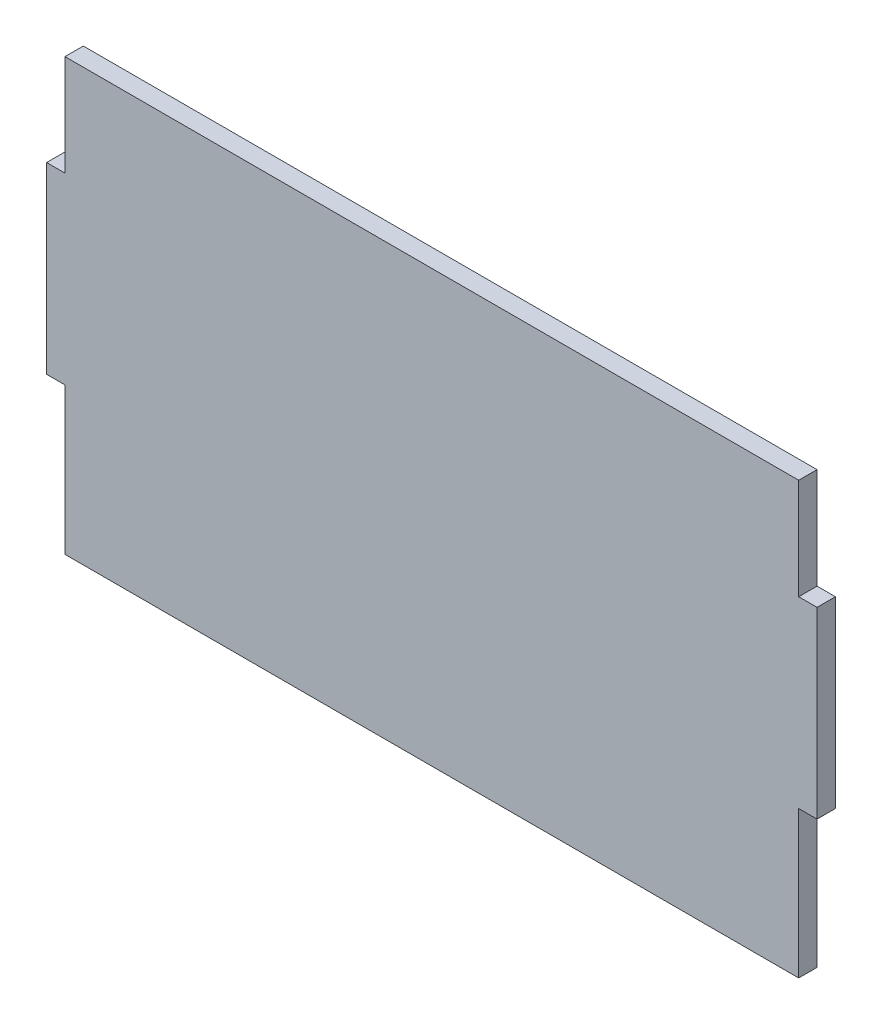
ISO-10303-21;
HEADER;
FILE_DESCRIPTION(('STEP AP214'),'2;1');
FILE_NAME('part.step','',(''),(''),'','','');
FILE_SCHEMA(('AUTOMOTIVE_DESIGN { 1 0 10303 214 1 1 1 1 }'));
ENDSEC;
DATA;
#1=APPLICATION_CONTEXT('core data for automotive mechanical design processes');
#2=APPLICATION_PROTOCOL_DEFINITION('international standard','automotive_design',2000,#1);
#3=PRODUCT_CONTEXT('',#1,'mechanical');
#4=PRODUCT('Part','Part','',(#3));
#5=PRODUCT_RELATED_PRODUCT_CATEGORY('part','',(#4));
#6=PRODUCT_DEFINITION_FORMATION('','',#4);
#7=PRODUCT_DEFINITION_CONTEXT('part definition',#1,'design');
#8=PRODUCT_DEFINITION('design','',#6,#7);
#9=PRODUCT_DEFINITION_SHAPE('','',#8);
#10=(LENGTH_UNIT() NAMED_UNIT(*) SI_UNIT(.MILLI.,.METRE.));
#11=(NAMED_UNIT(*) PLANE_ANGLE_UNIT() SI_UNIT($,.RADIAN.));
#12=(NAMED_UNIT(*) SI_UNIT($,.STERADIAN.) SOLID_ANGLE_UNIT());
#13=UNCERTAINTY_MEASURE_WITH_UNIT(LENGTH_MEASURE(1.E-05),#10,'distance_accuracy_value','');
#14=(GEOMETRIC_REPRESENTATION_CONTEXT(3) GLOBAL_UNCERTAINTY_ASSIGNED_CONTEXT((#13)) GLOBAL_UNIT_ASSIGNED_CONTEXT((#10,
#11,#12)) REPRESENTATION_CONTEXT('',''));
#15=CARTESIAN_POINT('',(0.,0.,0.));
#16=DIRECTION('',(0.,0.,1.));
#17=DIRECTION('',(1.,0.,0.));
#18=AXIS2_PLACEMENT_3D('',#15,#16,#17);
#19=CARTESIAN_POINT('',(0.,16.,2.));
#20=DIRECTION('',(0.,1.,0.));
#21=DIRECTION('',(0.,0.,1.));
#22=AXIS2_PLACEMENT_3D('',#19,#20,#21);
#23=PLANE('',#22);
#24=DIRECTION('',(1.,0.,0.));
#25=VECTOR('',#24,1.);
#26=CARTESIAN_POINT('',(0.,16.,0.));
#27=LINE('',#26,#25);
#28=CARTESIAN_POINT('',(80.,16.,0.));
#29=VERTEX_POINT('',#28);
#30=CARTESIAN_POINT('',(82.,16.,0.));
#31=VERTEX_POINT('',#30);
#32=EDGE_CURVE('E179',#29,#31,#27,.T.);
#33=ORIENTED_EDGE('',*,*,#32,.T.);
#34=DIRECTION('',(0.,0.,-1.));
#35=VECTOR('',#34,1.);
#36=CARTESIAN_POINT('',(82.,16.,2.));
#37=LINE('',#36,#35);
#38=CARTESIAN_POINT('',(82.,16.,2.));
#39=VERTEX_POINT('',#38);
#40=EDGE_CURVE('E183',#39,#31,#37,.T.);
#41=ORIENTED_EDGE('',*,*,#40,.F.);
#42=DIRECTION('',(1.,0.,0.));
#43=VECTOR('',#42,1.);
#44=CARTESIAN_POINT('',(0.,16.,2.));
#45=LINE('',#44,#43);
#46=CARTESIAN_POINT('',(80.,16.,2.));
#47=VERTEX_POINT('',#46);
#48=EDGE_CURVE('E187',#47,#39,#45,.T.);
#49=ORIENTED_EDGE('',*,*,#48,.F.);
#50=DIRECTION('',(0.,0.,-1.));
#51=VECTOR('',#50,1.);
#52=CARTESIAN_POINT('',(80.,16.,2.));
#53=LINE('',#52,#51);
#54=EDGE_CURVE('E186',#47,#29,#53,.T.);
#55=ORIENTED_EDGE('',*,*,#54,.T.);
#56=EDGE_LOOP('',(#33,#41,#49,#55));
#57=FACE_BOUND('',#56,.T.);
#58=ADVANCED_FACE('F73',(#57),#23,.F.);
#59=CARTESIAN_POINT('',(80.,0.,2.));
#60=DIRECTION('',(-1.,0.,0.));
#61=DIRECTION('',(0.,-1.,0.));
#62=AXIS2_PLACEMENT_3D('',#59,#60,#61);
#63=PLANE('',#62);
#64=DIRECTION('',(0.,1.,0.));
#65=VECTOR('',#64,1.);
#66=CARTESIAN_POINT('',(80.,0.,0.));
#67=LINE('',#66,#65);
#68=CARTESIAN_POINT('',(80.,0.,0.));
#69=VERTEX_POINT('',#68);
#70=EDGE_CURVE('E178',#69,#29,#67,.T.);
#71=ORIENTED_EDGE('',*,*,#70,.T.);
#72=ORIENTED_EDGE('',*,*,#54,.F.);
#73=DIRECTION('',(0.,1.,0.));
#74=VECTOR('',#73,1.);
#75=CARTESIAN_POINT('',(80.,0.,2.));
#76=LINE('',#75,#74);
#77=CARTESIAN_POINT('',(80.,0.,2.));
#78=VERTEX_POINT('',#77);
#79=EDGE_CURVE('E240',#78,#47,#76,.T.);
#80=ORIENTED_EDGE('',*,*,#79,.F.);
#81=DIRECTION('',(0.,0.,-1.));
#82=VECTOR('',#81,1.);
#83=CARTESIAN_POINT('',(80.,0.,2.));
#84=LINE('',#83,#82);
#85=EDGE_CURVE('E190',#78,#69,#84,.T.);
#86=ORIENTED_EDGE('',*,*,#85,.T.);
#87=EDGE_LOOP('',(#71,#72,#80,#86));
#88=FACE_BOUND('',#87,.T.);
#89=ADVANCED_FACE('F222',(#88),#63,.F.);
#90=CARTESIAN_POINT('',(80.,36.,0.));
#91=VERTEX_POINT('',#90);
#92=CARTESIAN_POINT('',(80.,47.,0.));
#93=VERTEX_POINT('',#92);
#94=EDGE_CURVE('E172',#91,#93,#67,.T.);
#95=ORIENTED_EDGE('',*,*,#94,.T.);
#96=DIRECTION('',(0.,0.,-1.));
#97=VECTOR('',#96,1.);
#98=CARTESIAN_POINT('',(80.,47.,2.));
#99=LINE('',#98,#97);
#100=CARTESIAN_POINT('',(80.,47.,2.));
#101=VERTEX_POINT('',#100);
#102=EDGE_CURVE('E154',#101,#93,#99,.T.);
#103=ORIENTED_EDGE('',*,*,#102,.F.);
#104=CARTESIAN_POINT('',(80.,36.,2.));
#105=VERTEX_POINT('',#104);
#106=EDGE_CURVE('E248',#105,#101,#76,.T.);
#107=ORIENTED_EDGE('',*,*,#106,.F.);
#108=DIRECTION('',(0.,0.,-1.));
#109=VECTOR('',#108,1.);
#110=CARTESIAN_POINT('',(80.,36.,2.));
#111=LINE('',#110,#109);
#112=EDGE_CURVE('E146',#105,#91,#111,.T.);
#113=ORIENTED_EDGE('',*,*,#112,.T.);
#114=EDGE_LOOP('',(#95,#103,#107,#113));
#115=FACE_BOUND('',#114,.T.);
#116=ADVANCED_FACE('F211',(#115),#63,.F.);
#117=CARTESIAN_POINT('',(0.,36.,2.));
#118=DIRECTION('',(0.,1.,0.));
#119=DIRECTION('',(0.,0.,1.));
#120=AXIS2_PLACEMENT_3D('',#117,#118,#119);
#121=PLANE('',#120);
#122=DIRECTION('',(1.,0.,0.));
#123=VECTOR('',#122,1.);
#124=CARTESIAN_POINT('',(0.,36.,0.));
#125=LINE('',#124,#123);
#126=CARTESIAN_POINT('',(82.,36.,0.));
#127=VERTEX_POINT('',#126);
#128=EDGE_CURVE('E214',#91,#127,#125,.T.);
#129=ORIENTED_EDGE('',*,*,#128,.F.);
#130=ORIENTED_EDGE('',*,*,#112,.F.);
#131=DIRECTION('',(1.,0.,0.));
#132=VECTOR('',#131,1.);
#133=CARTESIAN_POINT('',(0.,36.,2.));
#134=LINE('',#133,#132);
#135=CARTESIAN_POINT('',(82.,36.,2.));
#136=VERTEX_POINT('',#135);
#137=EDGE_CURVE('E251',#105,#136,#134,.T.);
#138=ORIENTED_EDGE('',*,*,#137,.T.);
#139=DIRECTION('',(0.,0.,-1.));
#140=VECTOR('',#139,1.);
#141=CARTESIAN_POINT('',(82.,36.,2.));
#142=LINE('',#141,#140);
#143=EDGE_CURVE('E142',#136,#127,#142,.T.);
#144=ORIENTED_EDGE('',*,*,#143,.T.);
#145=EDGE_LOOP('',(#129,#130,#138,#144));
#146=FACE_BOUND('',#145,.T.);
#147=ADVANCED_FACE('F264',(#146),#121,.T.);
#148=CARTESIAN_POINT('',(82.,0.,2.));
#149=DIRECTION('',(1.,0.,0.));
#150=DIRECTION('',(0.,0.,-1.));
#151=AXIS2_PLACEMENT_3D('',#148,#149,#150);
#152=PLANE('',#151);
#153=DIRECTION('',(0.,-1.,0.));
#154=VECTOR('',#153,1.);
#155=CARTESIAN_POINT('',(82.,0.,0.));
#156=LINE('',#155,#154);
#157=EDGE_CURVE('E215',#127,#31,#156,.T.);
#158=ORIENTED_EDGE('',*,*,#157,.F.);
#159=ORIENTED_EDGE('',*,*,#143,.F.);
#160=DIRECTION('',(0.,-1.,0.));
#161=VECTOR('',#160,1.);
#162=CARTESIAN_POINT('',(82.,0.,2.));
#163=LINE('',#162,#161);
#164=EDGE_CURVE('E182',#136,#39,#163,.T.);
#165=ORIENTED_EDGE('',*,*,#164,.T.);
#166=ORIENTED_EDGE('',*,*,#40,.T.);
#167=EDGE_LOOP('',(#158,#159,#165,#166));
#168=FACE_BOUND('',#167,.T.);
#169=ADVANCED_FACE('F256',(#168),#152,.T.);
#170=CARTESIAN_POINT('',(0.,47.,2.));
#171=DIRECTION('',(0.,1.,0.));
#172=DIRECTION('',(-1.,0.,0.));
#173=AXIS2_PLACEMENT_3D('',#170,#171,#172);
#174=PLANE('',#173);
#175=DIRECTION('',(1.,0.,0.));
#176=VECTOR('',#175,1.);
#177=CARTESIAN_POINT('',(0.,47.,0.));
#178=LINE('',#177,#176);
#179=CARTESIAN_POINT('',(0.,47.,0.));
#180=VERTEX_POINT('',#179);
#181=EDGE_CURVE('E169',#180,#93,#178,.T.);
#182=ORIENTED_EDGE('',*,*,#181,.F.);
#183=DIRECTION('',(0.,0.,-1.));
#184=VECTOR('',#183,1.);
#185=CARTESIAN_POINT('',(0.,47.,2.));
#186=LINE('',#185,#184);
#187=CARTESIAN_POINT('',(0.,47.,2.));
#188=VERTEX_POINT('',#187);
#189=EDGE_CURVE('E167',#188,#180,#186,.T.);
#190=ORIENTED_EDGE('',*,*,#189,.F.);
#191=DIRECTION('',(1.,0.,0.));
#192=VECTOR('',#191,1.);
#193=CARTESIAN_POINT('',(0.,47.,2.));
#194=LINE('',#193,#192);
#195=EDGE_CURVE('E205',#188,#101,#194,.T.);
#196=ORIENTED_EDGE('',*,*,#195,.T.);
#197=ORIENTED_EDGE('',*,*,#102,.T.);
#198=EDGE_LOOP('',(#182,#190,#196,#197));
#199=FACE_BOUND('',#198,.T.);
#200=ADVANCED_FACE('F202',(#199),#174,.T.);
#201=CARTESIAN_POINT('',(0.,0.,2.));
#202=DIRECTION('',(0.,1.,0.));
#203=DIRECTION('',(-1.,0.,0.));
#204=AXIS2_PLACEMENT_3D('',#201,#202,#203);
#205=PLANE('',#204);
#206=DIRECTION('',(1.,0.,0.));
#207=VECTOR('',#206,1.);
#208=CARTESIAN_POINT('',(0.,0.,0.));
#209=LINE('',#208,#207);
#210=CARTESIAN_POINT('',(0.,0.,0.));
#211=VERTEX_POINT('',#210);
#212=EDGE_CURVE('E171',#211,#69,#209,.T.);
#213=ORIENTED_EDGE('',*,*,#212,.T.);
#214=ORIENTED_EDGE('',*,*,#85,.F.);
#215=DIRECTION('',(1.,0.,0.));
#216=VECTOR('',#215,1.);
#217=CARTESIAN_POINT('',(0.,0.,2.));
#218=LINE('',#217,#216);
#219=CARTESIAN_POINT('',(0.,0.,2.));
#220=VERTEX_POINT('',#219);
#221=EDGE_CURVE('E241',#220,#78,#218,.T.);
#222=ORIENTED_EDGE('',*,*,#221,.F.);
#223=DIRECTION('',(0.,0.,-1.));
#224=VECTOR('',#223,1.);
#225=CARTESIAN_POINT('',(0.,0.,2.));
#226=LINE('',#225,#224);
#227=EDGE_CURVE('E193',#220,#211,#226,.T.);
#228=ORIENTED_EDGE('',*,*,#227,.T.);
#229=EDGE_LOOP('',(#213,#214,#222,#228));
#230=FACE_BOUND('',#229,.T.);
#231=ADVANCED_FACE('F284',(#230),#205,.F.);
#232=CARTESIAN_POINT('',(0.,0.,0.));
#233=DIRECTION('',(0.,0.,1.));
#234=DIRECTION('',(1.,0.,0.));
#235=AXIS2_PLACEMENT_3D('',#232,#233,#234);
#236=PLANE('',#235);
#237=ORIENTED_EDGE('',*,*,#157,.T.);
#238=ORIENTED_EDGE('',*,*,#32,.F.);
#239=ORIENTED_EDGE('',*,*,#70,.F.);
#240=ORIENTED_EDGE('',*,*,#212,.F.);
#241=DIRECTION('',(0.,1.,0.));
#242=VECTOR('',#241,1.);
#243=CARTESIAN_POINT('',(0.,0.,0.));
#244=LINE('',#243,#242);
#245=CARTESIAN_POINT('',(0.,16.,0.));
#246=VERTEX_POINT('',#245);
#247=EDGE_CURVE('E133',#211,#246,#244,.T.);
#248=ORIENTED_EDGE('',*,*,#247,.T.);
#249=DIRECTION('',(-1.,0.,0.));
#250=VECTOR('',#249,1.);
#251=CARTESIAN_POINT('',(0.,16.,0.));
#252=LINE('',#251,#250);
#253=CARTESIAN_POINT('',(-2.,16.,0.));
#254=VERTEX_POINT('',#253);
#255=EDGE_CURVE('E119',#246,#254,#252,.T.);
#256=ORIENTED_EDGE('',*,*,#255,.T.);
#257=DIRECTION('',(0.,-1.,0.));
#258=VECTOR('',#257,1.);
#259=CARTESIAN_POINT('',(-2.,36.,0.));
#260=LINE('',#259,#258);
#261=CARTESIAN_POINT('',(-2.,36.,0.));
#262=VERTEX_POINT('',#261);
#263=EDGE_CURVE('E109',#262,#254,#260,.T.);
#264=ORIENTED_EDGE('',*,*,#263,.F.);
#265=DIRECTION('',(-1.,0.,0.));
#266=VECTOR('',#265,1.);
#267=CARTESIAN_POINT('',(0.,36.,0.));
#268=LINE('',#267,#266);
#269=CARTESIAN_POINT('',(0.,36.,0.));
#270=VERTEX_POINT('',#269);
#271=EDGE_CURVE('E127',#270,#262,#268,.T.);
#272=ORIENTED_EDGE('',*,*,#271,.F.);
#273=EDGE_CURVE('E163',#270,#180,#244,.T.);
#274=ORIENTED_EDGE('',*,*,#273,.T.);
#275=ORIENTED_EDGE('',*,*,#181,.T.);
#276=ORIENTED_EDGE('',*,*,#94,.F.);
#277=ORIENTED_EDGE('',*,*,#128,.T.);
#278=EDGE_LOOP('',(#237,#238,#239,#240,#248,#256,#264,#272,#274,#275,#276,#277));
#279=FACE_BOUND('',#278,.T.);
#280=ADVANCED_FACE('F130',(#279),#236,.F.);
#281=CARTESIAN_POINT('',(0.,0.,2.));
#282=DIRECTION('',(0.,0.,1.));
#283=DIRECTION('',(1.,0.,0.));
#284=AXIS2_PLACEMENT_3D('',#281,#282,#283);
#285=PLANE('',#284);
#286=ORIENTED_EDGE('',*,*,#164,.F.);
#287=ORIENTED_EDGE('',*,*,#137,.F.);
#288=ORIENTED_EDGE('',*,*,#106,.T.);
#289=ORIENTED_EDGE('',*,*,#195,.F.);
#290=DIRECTION('',(0.,1.,0.));
#291=VECTOR('',#290,1.);
#292=CARTESIAN_POINT('',(0.,0.,2.));
#293=LINE('',#292,#291);
#294=CARTESIAN_POINT('',(0.,36.,2.));
#295=VERTEX_POINT('',#294);
#296=EDGE_CURVE('E246',#295,#188,#293,.T.);
#297=ORIENTED_EDGE('',*,*,#296,.F.);
#298=DIRECTION('',(-1.,0.,0.));
#299=VECTOR('',#298,1.);
#300=CARTESIAN_POINT('',(0.,36.,2.));
#301=LINE('',#300,#299);
#302=CARTESIAN_POINT('',(-2.,36.,2.));
#303=VERTEX_POINT('',#302);
#304=EDGE_CURVE('E134',#295,#303,#301,.T.);
#305=ORIENTED_EDGE('',*,*,#304,.T.);
#306=DIRECTION('',(0.,-1.,0.));
#307=VECTOR('',#306,1.);
#308=CARTESIAN_POINT('',(-2.,36.,2.));
#309=LINE('',#308,#307);
#310=CARTESIAN_POINT('',(-2.,16.,2.));
#311=VERTEX_POINT('',#310);
#312=EDGE_CURVE('E137',#303,#311,#309,.T.);
#313=ORIENTED_EDGE('',*,*,#312,.T.);
#314=DIRECTION('',(-1.,0.,0.));
#315=VECTOR('',#314,1.);
#316=CARTESIAN_POINT('',(0.,16.,2.));
#317=LINE('',#316,#315);
#318=CARTESIAN_POINT('',(0.,16.,2.));
#319=VERTEX_POINT('',#318);
#320=EDGE_CURVE('E122',#319,#311,#317,.T.);
#321=ORIENTED_EDGE('',*,*,#320,.F.);
#322=EDGE_CURVE('E244',#220,#319,#293,.T.);
#323=ORIENTED_EDGE('',*,*,#322,.F.);
#324=ORIENTED_EDGE('',*,*,#221,.T.);
#325=ORIENTED_EDGE('',*,*,#79,.T.);
#326=ORIENTED_EDGE('',*,*,#48,.T.);
#327=EDGE_LOOP('',(#286,#287,#288,#289,#297,#305,#313,#321,#323,#324,#325,#326));
#328=FACE_BOUND('',#327,.T.);
#329=ADVANCED_FACE('F260',(#328),#285,.T.);
#330=CARTESIAN_POINT('',(0.,0.,2.));
#331=DIRECTION('',(-1.,0.,0.));
#332=DIRECTION('',(0.,-1.,0.));
#333=AXIS2_PLACEMENT_3D('',#330,#331,#332);
#334=PLANE('',#333);
#335=ORIENTED_EDGE('',*,*,#322,.T.);
#336=DIRECTION('',(0.,0.,-1.));
#337=VECTOR('',#336,1.);
#338=CARTESIAN_POINT('',(0.,16.,2.));
#339=LINE('',#338,#337);
#340=EDGE_CURVE('E83',#319,#246,#339,.T.);
#341=ORIENTED_EDGE('',*,*,#340,.T.);
#342=ORIENTED_EDGE('',*,*,#247,.F.);
#343=ORIENTED_EDGE('',*,*,#227,.F.);
#344=EDGE_LOOP('',(#335,#341,#342,#343));
#345=FACE_BOUND('',#344,.T.);
#346=ADVANCED_FACE('F286',(#345),#334,.T.);
#347=DIRECTION('',(0.,0.,-1.));
#348=VECTOR('',#347,1.);
#349=CARTESIAN_POINT('',(0.,36.,2.));
#350=LINE('',#349,#348);
#351=EDGE_CURVE('E12',#295,#270,#350,.T.);
#352=ORIENTED_EDGE('',*,*,#351,.F.);
#353=ORIENTED_EDGE('',*,*,#296,.T.);
#354=ORIENTED_EDGE('',*,*,#189,.T.);
#355=ORIENTED_EDGE('',*,*,#273,.F.);
#356=EDGE_LOOP('',(#352,#353,#354,#355));
#357=FACE_BOUND('',#356,.T.);
#358=ADVANCED_FACE('F165',(#357),#334,.T.);
#359=CARTESIAN_POINT('',(-2.,36.,2.));
#360=DIRECTION('',(1.,0.,0.));
#361=DIRECTION('',(0.,1.,0.));
#362=AXIS2_PLACEMENT_3D('',#359,#360,#361);
#363=PLANE('',#362);
#364=ORIENTED_EDGE('',*,*,#263,.T.);
#365=DIRECTION('',(0.,0.,-1.));
#366=VECTOR('',#365,1.);
#367=CARTESIAN_POINT('',(-2.,16.,2.));
#368=LINE('',#367,#366);
#369=EDGE_CURVE('E116',#311,#254,#368,.T.);
#370=ORIENTED_EDGE('',*,*,#369,.F.);
#371=ORIENTED_EDGE('',*,*,#312,.F.);
#372=DIRECTION('',(0.,0.,-1.));
#373=VECTOR('',#372,1.);
#374=CARTESIAN_POINT('',(-2.,36.,2.));
#375=LINE('',#374,#373);
#376=EDGE_CURVE('E77',#303,#262,#375,.T.);
#377=ORIENTED_EDGE('',*,*,#376,.T.);
#378=EDGE_LOOP('',(#364,#370,#371,#377));
#379=FACE_BOUND('',#378,.T.);
#380=ADVANCED_FACE('F124',(#379),#363,.F.);
#381=CARTESIAN_POINT('',(0.,16.,2.));
#382=DIRECTION('',(0.,-1.,0.));
#383=DIRECTION('',(1.,0.,0.));
#384=AXIS2_PLACEMENT_3D('',#381,#382,#383);
#385=PLANE('',#384);
#386=ORIENTED_EDGE('',*,*,#255,.F.);
#387=ORIENTED_EDGE('',*,*,#340,.F.);
#388=ORIENTED_EDGE('',*,*,#320,.T.);
#389=ORIENTED_EDGE('',*,*,#369,.T.);
#390=EDGE_LOOP('',(#386,#387,#388,#389));
#391=FACE_BOUND('',#390,.T.);
#392=ADVANCED_FACE('F117',(#391),#385,.T.);
#393=CARTESIAN_POINT('',(0.,36.,2.));
#394=DIRECTION('',(0.,-1.,0.));
#395=DIRECTION('',(1.,0.,0.));
#396=AXIS2_PLACEMENT_3D('',#393,#394,#395);
#397=PLANE('',#396);
#398=ORIENTED_EDGE('',*,*,#271,.T.);
#399=ORIENTED_EDGE('',*,*,#376,.F.);
#400=ORIENTED_EDGE('',*,*,#304,.F.);
#401=ORIENTED_EDGE('',*,*,#351,.T.);
#402=EDGE_LOOP('',(#398,#399,#400,#401));
#403=FACE_BOUND('',#402,.T.);
#404=ADVANCED_FACE('F75',(#403),#397,.F.);
#405=CLOSED_SHELL('',(#58,#89,#116,#147,#169,#200,#231,#280,#329,#346,#358,#380,#392,#404));
#406=MANIFOLD_SOLID_BREP('B2',#405);
#407=ADVANCED_BREP_SHAPE_REPRESENTATION('',(#18,#406),#14);
#408=SHAPE_DEFINITION_REPRESENTATION(#9,#407);
ENDSEC;
END-ISO-10303-21;
